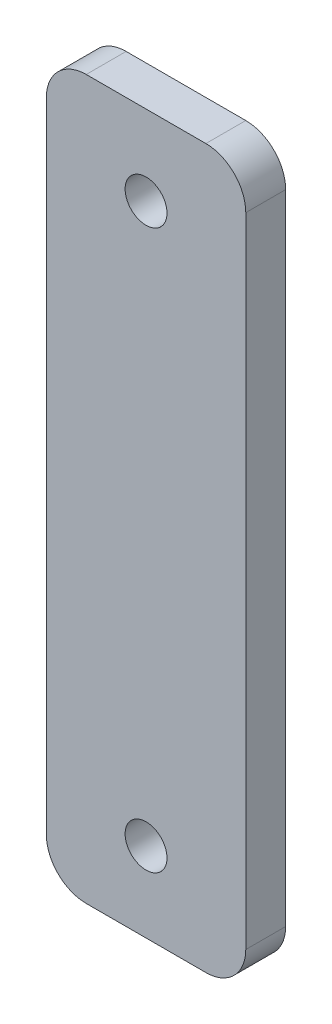
ISO-10303-21;
HEADER;
FILE_DESCRIPTION(('STEP AP214'),'2;1');
FILE_NAME('part.step','',(''),(''),'','','');
FILE_SCHEMA(('AUTOMOTIVE_DESIGN { 1 0 10303 214 1 1 1 1 }'));
ENDSEC;
DATA;
#1=APPLICATION_CONTEXT('core data for automotive mechanical design processes');
#2=APPLICATION_PROTOCOL_DEFINITION('international standard','automotive_design',2000,#1);
#3=PRODUCT_CONTEXT('',#1,'mechanical');
#4=PRODUCT('Part','Part','',(#3));
#5=PRODUCT_RELATED_PRODUCT_CATEGORY('part','',(#4));
#6=PRODUCT_DEFINITION_FORMATION('','',#4);
#7=PRODUCT_DEFINITION_CONTEXT('part definition',#1,'design');
#8=PRODUCT_DEFINITION('design','',#6,#7);
#9=PRODUCT_DEFINITION_SHAPE('','',#8);
#10=(LENGTH_UNIT() NAMED_UNIT(*) SI_UNIT(.MILLI.,.METRE.));
#11=(NAMED_UNIT(*) PLANE_ANGLE_UNIT() SI_UNIT($,.RADIAN.));
#12=(NAMED_UNIT(*) SI_UNIT($,.STERADIAN.) SOLID_ANGLE_UNIT());
#13=UNCERTAINTY_MEASURE_WITH_UNIT(LENGTH_MEASURE(1.E-05),#10,'distance_accuracy_value','');
#14=(GEOMETRIC_REPRESENTATION_CONTEXT(3) GLOBAL_UNCERTAINTY_ASSIGNED_CONTEXT((#13)) GLOBAL_UNIT_ASSIGNED_CONTEXT((#10,
#11,#12)) REPRESENTATION_CONTEXT('',''));
#15=CARTESIAN_POINT('',(0.,0.,0.));
#16=DIRECTION('',(0.,0.,1.));
#17=DIRECTION('',(1.,0.,0.));
#18=AXIS2_PLACEMENT_3D('',#15,#16,#17);
#19=CARTESIAN_POINT('',(25.,89.9999999999999,-10.));
#20=DIRECTION('',(1.,0.,0.));
#21=DIRECTION('',(0.,1.,0.));
#22=AXIS2_PLACEMENT_3D('',#19,#20,#21);
#23=PLANE('',#22);
#24=DIRECTION('',(0.,1.,0.));
#25=VECTOR('',#24,1.);
#26=CARTESIAN_POINT('',(25.,89.9999999999999,-10.));
#27=LINE('',#26,#25);
#28=CARTESIAN_POINT('',(25.,-80.,-10.0000000000001));
#29=VERTEX_POINT('',#28);
#30=CARTESIAN_POINT('',(24.9999999999999,79.9999999999999,-10.));
#31=VERTEX_POINT('',#30);
#32=EDGE_CURVE('E198',#29,#31,#27,.T.);
#33=ORIENTED_EDGE('',*,*,#32,.T.);
#34=DIRECTION('',(0.,0.,1.));
#35=VECTOR('',#34,1.);
#36=CARTESIAN_POINT('',(24.9999999999999,79.9999999999999,-10.));
#37=LINE('',#36,#35);
#38=CARTESIAN_POINT('',(24.9999999999999,79.9999999999999,0.));
#39=VERTEX_POINT('',#38);
#40=EDGE_CURVE('E177',#31,#39,#37,.T.);
#41=ORIENTED_EDGE('',*,*,#40,.T.);
#42=DIRECTION('',(0.,1.,0.));
#43=VECTOR('',#42,1.);
#44=CARTESIAN_POINT('',(25.,89.9999999999999,0.));
#45=LINE('',#44,#43);
#46=CARTESIAN_POINT('',(25.,-80.,0.));
#47=VERTEX_POINT('',#46);
#48=EDGE_CURVE('E114',#47,#39,#45,.T.);
#49=ORIENTED_EDGE('',*,*,#48,.F.);
#50=DIRECTION('',(0.,0.,1.));
#51=VECTOR('',#50,1.);
#52=CARTESIAN_POINT('',(25.,-80.,-10.0000000000001));
#53=LINE('',#52,#51);
#54=EDGE_CURVE('E174',#47,#29,#53,.F.);
#55=ORIENTED_EDGE('',*,*,#54,.T.);
#56=EDGE_LOOP('',(#33,#41,#49,#55));
#57=FACE_BOUND('',#56,.T.);
#58=ADVANCED_FACE('F42',(#57),#23,.T.);
#59=CARTESIAN_POINT('',(-25.,-90.,-10.0000000000001));
#60=DIRECTION('',(0.,-1.,0.));
#61=DIRECTION('',(0.,0.,-1.));
#62=AXIS2_PLACEMENT_3D('',#59,#60,#61);
#63=PLANE('',#62);
#64=DIRECTION('',(1.,0.,0.));
#65=VECTOR('',#64,1.);
#66=CARTESIAN_POINT('',(-25.,-90.,-10.0000000000001));
#67=LINE('',#66,#65);
#68=CARTESIAN_POINT('',(-15.,-90.,-10.0000000000001));
#69=VERTEX_POINT('',#68);
#70=CARTESIAN_POINT('',(15.,-90.0000000000001,-10.0000000000001));
#71=VERTEX_POINT('',#70);
#72=EDGE_CURVE('E138',#69,#71,#67,.T.);
#73=ORIENTED_EDGE('',*,*,#72,.T.);
#74=DIRECTION('',(0.,0.,1.));
#75=VECTOR('',#74,1.);
#76=CARTESIAN_POINT('',(15.,-90.0000000000001,-10.0000000000001));
#77=LINE('',#76,#75);
#78=CARTESIAN_POINT('',(15.,-90.0000000000001,0.));
#79=VERTEX_POINT('',#78);
#80=EDGE_CURVE('E11',#71,#79,#77,.T.);
#81=ORIENTED_EDGE('',*,*,#80,.T.);
#82=DIRECTION('',(1.,0.,0.));
#83=VECTOR('',#82,1.);
#84=CARTESIAN_POINT('',(-25.,-90.,0.));
#85=LINE('',#84,#83);
#86=CARTESIAN_POINT('',(-15.,-90.,0.));
#87=VERTEX_POINT('',#86);
#88=EDGE_CURVE('E148',#87,#79,#85,.T.);
#89=ORIENTED_EDGE('',*,*,#88,.F.);
#90=DIRECTION('',(0.,0.,1.));
#91=VECTOR('',#90,1.);
#92=CARTESIAN_POINT('',(-15.,-90.,-10.0000000000001));
#93=LINE('',#92,#91);
#94=EDGE_CURVE('E51',#87,#69,#93,.F.);
#95=ORIENTED_EDGE('',*,*,#94,.T.);
#96=EDGE_LOOP('',(#73,#81,#89,#95));
#97=FACE_BOUND('',#96,.T.);
#98=ADVANCED_FACE('F242',(#97),#63,.T.);
#99=CARTESIAN_POINT('',(-25.0000000000001,90.,-10.));
#100=DIRECTION('',(-1.,0.,0.));
#101=DIRECTION('',(0.,-1.,0.));
#102=AXIS2_PLACEMENT_3D('',#99,#100,#101);
#103=PLANE('',#102);
#104=DIRECTION('',(0.,-1.,0.));
#105=VECTOR('',#104,1.);
#106=CARTESIAN_POINT('',(-25.0000000000001,90.,0.));
#107=LINE('',#106,#105);
#108=CARTESIAN_POINT('',(-25.0000000000001,80.,0.));
#109=VERTEX_POINT('',#108);
#110=CARTESIAN_POINT('',(-25.,-79.9999999999999,0.));
#111=VERTEX_POINT('',#110);
#112=EDGE_CURVE('E132',#109,#111,#107,.T.);
#113=ORIENTED_EDGE('',*,*,#112,.F.);
#114=DIRECTION('',(0.,0.,1.));
#115=VECTOR('',#114,1.);
#116=CARTESIAN_POINT('',(-25.0000000000001,80.,-10.));
#117=LINE('',#116,#115);
#118=CARTESIAN_POINT('',(-25.0000000000001,80.,-10.));
#119=VERTEX_POINT('',#118);
#120=EDGE_CURVE('E161',#109,#119,#117,.F.);
#121=ORIENTED_EDGE('',*,*,#120,.T.);
#122=DIRECTION('',(0.,-1.,0.));
#123=VECTOR('',#122,1.);
#124=CARTESIAN_POINT('',(-25.0000000000001,90.,-10.));
#125=LINE('',#124,#123);
#126=CARTESIAN_POINT('',(-25.,-79.9999999999999,-10.0000000000001));
#127=VERTEX_POINT('',#126);
#128=EDGE_CURVE('E145',#119,#127,#125,.T.);
#129=ORIENTED_EDGE('',*,*,#128,.T.);
#130=DIRECTION('',(0.,0.,1.));
#131=VECTOR('',#130,1.);
#132=CARTESIAN_POINT('',(-25.,-80.,-10.0000000000001));
#133=LINE('',#132,#131);
#134=EDGE_CURVE('E157',#127,#111,#133,.T.);
#135=ORIENTED_EDGE('',*,*,#134,.T.);
#136=EDGE_LOOP('',(#113,#121,#129,#135));
#137=FACE_BOUND('',#136,.T.);
#138=ADVANCED_FACE('F221',(#137),#103,.T.);
#139=CARTESIAN_POINT('',(-25.0000000000001,90.,-10.));
#140=DIRECTION('',(0.,1.,0.));
#141=DIRECTION('',(0.,0.,1.));
#142=AXIS2_PLACEMENT_3D('',#139,#140,#141);
#143=PLANE('',#142);
#144=DIRECTION('',(-1.,0.,0.));
#145=VECTOR('',#144,1.);
#146=CARTESIAN_POINT('',(-25.0000000000001,90.,-10.));
#147=LINE('',#146,#145);
#148=CARTESIAN_POINT('',(15.,89.9999999999999,-10.));
#149=VERTEX_POINT('',#148);
#150=CARTESIAN_POINT('',(-15.0000000000001,90.,-10.));
#151=VERTEX_POINT('',#150);
#152=EDGE_CURVE('E200',#149,#151,#147,.T.);
#153=ORIENTED_EDGE('',*,*,#152,.T.);
#154=DIRECTION('',(0.,0.,1.));
#155=VECTOR('',#154,1.);
#156=CARTESIAN_POINT('',(-15.0000000000001,90.,-10.));
#157=LINE('',#156,#155);
#158=CARTESIAN_POINT('',(-15.0000000000001,90.,0.));
#159=VERTEX_POINT('',#158);
#160=EDGE_CURVE('E130',#151,#159,#157,.T.);
#161=ORIENTED_EDGE('',*,*,#160,.T.);
#162=DIRECTION('',(-1.,0.,0.));
#163=VECTOR('',#162,1.);
#164=CARTESIAN_POINT('',(-25.0000000000001,90.,0.));
#165=LINE('',#164,#163);
#166=CARTESIAN_POINT('',(15.,89.9999999999999,0.));
#167=VERTEX_POINT('',#166);
#168=EDGE_CURVE('E112',#167,#159,#165,.T.);
#169=ORIENTED_EDGE('',*,*,#168,.F.);
#170=DIRECTION('',(0.,0.,1.));
#171=VECTOR('',#170,1.);
#172=CARTESIAN_POINT('',(15.,89.9999999999999,-10.));
#173=LINE('',#172,#171);
#174=EDGE_CURVE('E127',#167,#149,#173,.F.);
#175=ORIENTED_EDGE('',*,*,#174,.T.);
#176=EDGE_LOOP('',(#153,#161,#169,#175));
#177=FACE_BOUND('',#176,.T.);
#178=ADVANCED_FACE('F126',(#177),#143,.T.);
#179=CARTESIAN_POINT('',(0.,0.,-10.));
#180=DIRECTION('',(0.,0.,1.));
#181=DIRECTION('',(1.,0.,0.));
#182=AXIS2_PLACEMENT_3D('',#179,#180,#181);
#183=PLANE('',#182);
#184=CARTESIAN_POINT('',(0.,70.,-10.0000000000001));
#185=DIRECTION('',(0.,0.,1.));
#186=DIRECTION('',(1.,0.,0.));
#187=AXIS2_PLACEMENT_3D('',#184,#185,#186);
#188=CIRCLE('',#187,5.25);
#189=CARTESIAN_POINT('',(5.24999999999992,70.,-10.0000000000001));
#190=VERTEX_POINT('',#189);
#191=EDGE_CURVE('E208',#190,#190,#188,.T.);
#192=ORIENTED_EDGE('',*,*,#191,.T.);
#193=EDGE_LOOP('',(#192));
#194=FACE_BOUND('',#193,.T.);
#195=CARTESIAN_POINT('',(0.,-70.,-10.0000000000001));
#196=DIRECTION('',(0.,0.,1.));
#197=DIRECTION('',(1.,0.,0.));
#198=AXIS2_PLACEMENT_3D('',#195,#196,#197);
#199=CIRCLE('',#198,5.25);
#200=CARTESIAN_POINT('',(5.25,-70.,-10.0000000000001));
#201=VERTEX_POINT('',#200);
#202=EDGE_CURVE('E374',#201,#201,#199,.T.);
#203=ORIENTED_EDGE('',*,*,#202,.T.);
#204=EDGE_LOOP('',(#203));
#205=FACE_BOUND('',#204,.T.);
#206=ORIENTED_EDGE('',*,*,#128,.F.);
#207=CARTESIAN_POINT('',(-15.0000000000001,80.,-10.));
#208=DIRECTION('',(0.,0.,1.));
#209=DIRECTION('',(1.,0.,0.));
#210=AXIS2_PLACEMENT_3D('',#207,#208,#209);
#211=CIRCLE('',#210,10.);
#212=EDGE_CURVE('E171',#119,#151,#211,.F.);
#213=ORIENTED_EDGE('',*,*,#212,.T.);
#214=ORIENTED_EDGE('',*,*,#152,.F.);
#215=CARTESIAN_POINT('',(15.,79.9999999999999,-10.));
#216=DIRECTION('',(0.,0.,1.));
#217=DIRECTION('',(1.,0.,0.));
#218=AXIS2_PLACEMENT_3D('',#215,#216,#217);
#219=CIRCLE('',#218,10.);
#220=EDGE_CURVE('E136',#149,#31,#219,.F.);
#221=ORIENTED_EDGE('',*,*,#220,.T.);
#222=ORIENTED_EDGE('',*,*,#32,.F.);
#223=CARTESIAN_POINT('',(15.,-80.0000000000001,-10.0000000000001));
#224=DIRECTION('',(0.,0.,1.));
#225=DIRECTION('',(1.,0.,0.));
#226=AXIS2_PLACEMENT_3D('',#223,#224,#225);
#227=CIRCLE('',#226,10.);
#228=EDGE_CURVE('E58',#29,#71,#227,.F.);
#229=ORIENTED_EDGE('',*,*,#228,.T.);
#230=ORIENTED_EDGE('',*,*,#72,.F.);
#231=CARTESIAN_POINT('',(-15.,-80.,-10.0000000000001));
#232=DIRECTION('',(0.,0.,1.));
#233=DIRECTION('',(1.,0.,0.));
#234=AXIS2_PLACEMENT_3D('',#231,#232,#233);
#235=CIRCLE('',#234,10.);
#236=EDGE_CURVE('E164',#69,#127,#235,.F.);
#237=ORIENTED_EDGE('',*,*,#236,.T.);
#238=EDGE_LOOP('',(#206,#213,#214,#221,#222,#229,#230,#237));
#239=FACE_BOUND('',#238,.T.);
#240=ADVANCED_FACE('F227',(#194,#205,#239),#183,.F.);
#241=CARTESIAN_POINT('',(0.,0.,0.));
#242=DIRECTION('',(0.,0.,1.));
#243=DIRECTION('',(1.,0.,0.));
#244=AXIS2_PLACEMENT_3D('',#241,#242,#243);
#245=PLANE('',#244);
#246=CARTESIAN_POINT('',(0.,70.,0.));
#247=DIRECTION('',(0.,0.,1.));
#248=DIRECTION('',(1.,0.,0.));
#249=AXIS2_PLACEMENT_3D('',#246,#247,#248);
#250=CIRCLE('',#249,5.25);
#251=CARTESIAN_POINT('',(5.24999999999992,70.,0.));
#252=VERTEX_POINT('',#251);
#253=EDGE_CURVE('E377',#252,#252,#250,.T.);
#254=ORIENTED_EDGE('',*,*,#253,.F.);
#255=EDGE_LOOP('',(#254));
#256=FACE_BOUND('',#255,.T.);
#257=CARTESIAN_POINT('',(0.,-70.,0.));
#258=DIRECTION('',(0.,0.,1.));
#259=DIRECTION('',(1.,0.,0.));
#260=AXIS2_PLACEMENT_3D('',#257,#258,#259);
#261=CIRCLE('',#260,5.25);
#262=CARTESIAN_POINT('',(5.25,-70.,0.));
#263=VERTEX_POINT('',#262);
#264=EDGE_CURVE('E382',#263,#263,#261,.T.);
#265=ORIENTED_EDGE('',*,*,#264,.F.);
#266=EDGE_LOOP('',(#265));
#267=FACE_BOUND('',#266,.T.);
#268=ORIENTED_EDGE('',*,*,#168,.T.);
#269=CARTESIAN_POINT('',(-15.0000000000001,80.,0.));
#270=DIRECTION('',(0.,0.,1.));
#271=DIRECTION('',(1.,0.,0.));
#272=AXIS2_PLACEMENT_3D('',#269,#270,#271);
#273=CIRCLE('',#272,10.);
#274=EDGE_CURVE('E120',#159,#109,#273,.T.);
#275=ORIENTED_EDGE('',*,*,#274,.T.);
#276=ORIENTED_EDGE('',*,*,#112,.T.);
#277=CARTESIAN_POINT('',(-15.,-80.,0.));
#278=DIRECTION('',(0.,0.,1.));
#279=DIRECTION('',(1.,0.,0.));
#280=AXIS2_PLACEMENT_3D('',#277,#278,#279);
#281=CIRCLE('',#280,10.);
#282=EDGE_CURVE('E143',#111,#87,#281,.T.);
#283=ORIENTED_EDGE('',*,*,#282,.T.);
#284=ORIENTED_EDGE('',*,*,#88,.T.);
#285=CARTESIAN_POINT('',(15.,-80.0000000000001,0.));
#286=DIRECTION('',(0.,0.,1.));
#287=DIRECTION('',(1.,0.,0.));
#288=AXIS2_PLACEMENT_3D('',#285,#286,#287);
#289=CIRCLE('',#288,10.);
#290=EDGE_CURVE('E121',#79,#47,#289,.T.);
#291=ORIENTED_EDGE('',*,*,#290,.T.);
#292=ORIENTED_EDGE('',*,*,#48,.T.);
#293=CARTESIAN_POINT('',(15.,79.9999999999999,0.));
#294=DIRECTION('',(0.,0.,1.));
#295=DIRECTION('',(1.,0.,0.));
#296=AXIS2_PLACEMENT_3D('',#293,#294,#295);
#297=CIRCLE('',#296,10.);
#298=EDGE_CURVE('E109',#39,#167,#297,.T.);
#299=ORIENTED_EDGE('',*,*,#298,.T.);
#300=EDGE_LOOP('',(#268,#275,#276,#283,#284,#291,#292,#299));
#301=FACE_BOUND('',#300,.T.);
#302=ADVANCED_FACE('F111',(#256,#267,#301),#245,.T.);
#303=CARTESIAN_POINT('',(-15.0000000000001,80.,-10.));
#304=DIRECTION('',(0.,0.,1.));
#305=DIRECTION('',(1.,0.,0.));
#306=AXIS2_PLACEMENT_3D('',#303,#304,#305);
#307=CYLINDRICAL_SURFACE('',#306,10.);
#308=ORIENTED_EDGE('',*,*,#212,.F.);
#309=ORIENTED_EDGE('',*,*,#120,.F.);
#310=ORIENTED_EDGE('',*,*,#274,.F.);
#311=ORIENTED_EDGE('',*,*,#160,.F.);
#312=EDGE_LOOP('',(#308,#309,#310,#311));
#313=FACE_BOUND('',#312,.T.);
#314=ADVANCED_FACE('F226',(#313),#307,.T.);
#315=CARTESIAN_POINT('',(15.,79.9999999999999,-10.));
#316=DIRECTION('',(0.,0.,1.));
#317=DIRECTION('',(1.,0.,0.));
#318=AXIS2_PLACEMENT_3D('',#315,#316,#317);
#319=CYLINDRICAL_SURFACE('',#318,10.);
#320=ORIENTED_EDGE('',*,*,#220,.F.);
#321=ORIENTED_EDGE('',*,*,#174,.F.);
#322=ORIENTED_EDGE('',*,*,#298,.F.);
#323=ORIENTED_EDGE('',*,*,#40,.F.);
#324=EDGE_LOOP('',(#320,#321,#322,#323));
#325=FACE_BOUND('',#324,.T.);
#326=ADVANCED_FACE('F135',(#325),#319,.T.);
#327=CARTESIAN_POINT('',(15.,-80.0000000000001,-10.0000000000001));
#328=DIRECTION('',(0.,0.,1.));
#329=DIRECTION('',(1.,0.,0.));
#330=AXIS2_PLACEMENT_3D('',#327,#328,#329);
#331=CYLINDRICAL_SURFACE('',#330,10.);
#332=ORIENTED_EDGE('',*,*,#228,.F.);
#333=ORIENTED_EDGE('',*,*,#54,.F.);
#334=ORIENTED_EDGE('',*,*,#290,.F.);
#335=ORIENTED_EDGE('',*,*,#80,.F.);
#336=EDGE_LOOP('',(#332,#333,#334,#335));
#337=FACE_BOUND('',#336,.T.);
#338=ADVANCED_FACE('F232',(#337),#331,.T.);
#339=CARTESIAN_POINT('',(-15.,-80.,-10.0000000000001));
#340=DIRECTION('',(0.,0.,1.));
#341=DIRECTION('',(1.,0.,0.));
#342=AXIS2_PLACEMENT_3D('',#339,#340,#341);
#343=CYLINDRICAL_SURFACE('',#342,10.);
#344=ORIENTED_EDGE('',*,*,#236,.F.);
#345=ORIENTED_EDGE('',*,*,#94,.F.);
#346=ORIENTED_EDGE('',*,*,#282,.F.);
#347=ORIENTED_EDGE('',*,*,#134,.F.);
#348=EDGE_LOOP('',(#344,#345,#346,#347));
#349=FACE_BOUND('',#348,.T.);
#350=ADVANCED_FACE('F44',(#349),#343,.T.);
#351=CARTESIAN_POINT('',(0.,-69.9999999999999,-20.0000000000001));
#352=DIRECTION('',(0.,0.,1.));
#353=DIRECTION('',(1.,0.,0.));
#354=AXIS2_PLACEMENT_3D('',#351,#352,#353);
#355=CYLINDRICAL_SURFACE('',#354,5.25);
#356=ORIENTED_EDGE('',*,*,#264,.T.);
#357=EDGE_LOOP('',(#356));
#358=FACE_BOUND('',#357,.T.);
#359=ORIENTED_EDGE('',*,*,#202,.F.);
#360=EDGE_LOOP('',(#359));
#361=FACE_BOUND('',#360,.T.);
#362=ADVANCED_FACE('F231',(#358,#361),#355,.F.);
#363=CARTESIAN_POINT('',(0.,70.0000000000001,-20.0000000000001));
#364=DIRECTION('',(0.,0.,1.));
#365=DIRECTION('',(1.,0.,0.));
#366=AXIS2_PLACEMENT_3D('',#363,#364,#365);
#367=CYLINDRICAL_SURFACE('',#366,5.25);
#368=ORIENTED_EDGE('',*,*,#253,.T.);
#369=EDGE_LOOP('',(#368));
#370=FACE_BOUND('',#369,.T.);
#371=ORIENTED_EDGE('',*,*,#191,.F.);
#372=EDGE_LOOP('',(#371));
#373=FACE_BOUND('',#372,.T.);
#374=ADVANCED_FACE('F237',(#370,#373),#367,.F.);
#375=CLOSED_SHELL('',(#58,#98,#138,#178,#240,#302,#314,#326,#338,#350,#362,#374));
#376=MANIFOLD_SOLID_BREP('B2',#375);
#377=ADVANCED_BREP_SHAPE_REPRESENTATION('',(#18,#376),#14);
#378=SHAPE_DEFINITION_REPRESENTATION(#9,#377);
ENDSEC;
END-ISO-10303-21;
